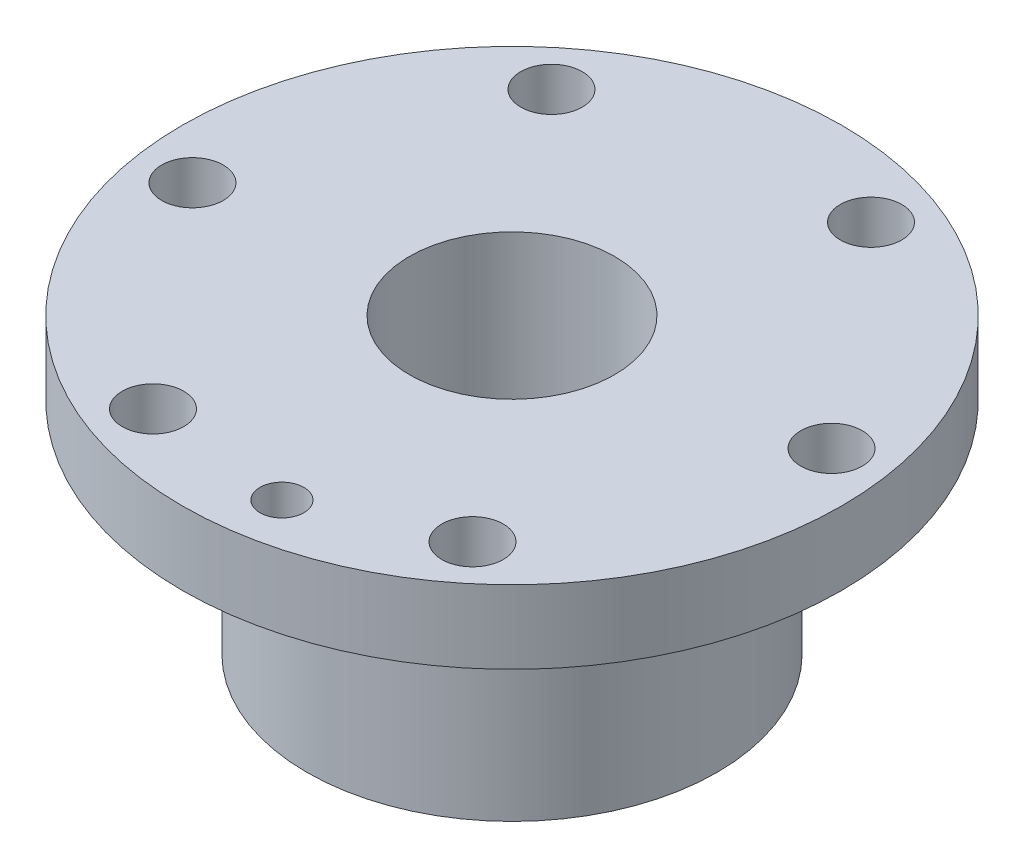
ISO-10303-21;
HEADER;
FILE_DESCRIPTION(('STEP AP214'),'2;1');
FILE_NAME('part.step','',(''),(''),'','','');
FILE_SCHEMA(('AUTOMOTIVE_DESIGN { 1 0 10303 214 1 1 1 1 }'));
ENDSEC;
DATA;
#1=APPLICATION_CONTEXT('core data for automotive mechanical design processes');
#2=APPLICATION_PROTOCOL_DEFINITION('international standard','automotive_design',2000,#1);
#3=PRODUCT_CONTEXT('',#1,'mechanical');
#4=PRODUCT('Part','Part','',(#3));
#5=PRODUCT_RELATED_PRODUCT_CATEGORY('part','',(#4));
#6=PRODUCT_DEFINITION_FORMATION('','',#4);
#7=PRODUCT_DEFINITION_CONTEXT('part definition',#1,'design');
#8=PRODUCT_DEFINITION('design','',#6,#7);
#9=PRODUCT_DEFINITION_SHAPE('','',#8);
#10=(LENGTH_UNIT() NAMED_UNIT(*) SI_UNIT(.MILLI.,.METRE.));
#11=(NAMED_UNIT(*) PLANE_ANGLE_UNIT() SI_UNIT($,.RADIAN.));
#12=(NAMED_UNIT(*) SI_UNIT($,.STERADIAN.) SOLID_ANGLE_UNIT());
#13=UNCERTAINTY_MEASURE_WITH_UNIT(LENGTH_MEASURE(1.E-05),#10,'distance_accuracy_value','');
#14=(GEOMETRIC_REPRESENTATION_CONTEXT(3) GLOBAL_UNCERTAINTY_ASSIGNED_CONTEXT((#13)) GLOBAL_UNIT_ASSIGNED_CONTEXT((#10,
#11,#12)) REPRESENTATION_CONTEXT('',''));
#15=CARTESIAN_POINT('',(0.,0.,0.));
#16=DIRECTION('',(0.,0.,1.));
#17=DIRECTION('',(1.,0.,0.));
#18=AXIS2_PLACEMENT_3D('',#15,#16,#17);
#19=CARTESIAN_POINT('',(0.,0.,0.));
#20=DIRECTION('',(0.,1.,0.));
#21=DIRECTION('',(0.,0.,1.));
#22=AXIS2_PLACEMENT_3D('',#19,#20,#21);
#23=PLANE('',#22);
#24=CARTESIAN_POINT('',(0.,0.,0.));
#25=DIRECTION('',(0.,1.,0.));
#26=DIRECTION('',(0.,0.,1.));
#27=AXIS2_PLACEMENT_3D('',#24,#25,#26);
#28=CIRCLE('',#27,14.);
#29=CARTESIAN_POINT('',(0.,0.,14.));
#30=VERTEX_POINT('',#29);
#31=EDGE_CURVE('E11',#30,#30,#28,.F.);
#32=ORIENTED_EDGE('',*,*,#31,.F.);
#33=EDGE_LOOP('',(#32));
#34=FACE_BOUND('',#33,.T.);
#35=CARTESIAN_POINT('',(-12.0199736534474,0.,-14.7146265114147));
#36=DIRECTION('',(0.,-1.,0.));
#37=DIRECTION('',(0.,0.,-1.));
#38=AXIS2_PLACEMENT_3D('',#35,#36,#37);
#39=CIRCLE('',#38,2.1);
#40=CARTESIAN_POINT('',(-12.0199736534474,0.,-16.8146265114147));
#41=VERTEX_POINT('',#40);
#42=EDGE_CURVE('E112',#41,#41,#39,.T.);
#43=ORIENTED_EDGE('',*,*,#42,.F.);
#44=EDGE_LOOP('',(#43));
#45=FACE_BOUND('',#44,.T.);
#46=CARTESIAN_POINT('',(6.73325353936205,0.,-17.7669157924122));
#47=DIRECTION('',(0.,-1.,0.));
#48=DIRECTION('',(0.,0.,-1.));
#49=AXIS2_PLACEMENT_3D('',#46,#47,#48);
#50=CIRCLE('',#49,2.1);
#51=CARTESIAN_POINT('',(6.73325353936205,0.,-19.8669157924122));
#52=VERTEX_POINT('',#51);
#53=EDGE_CURVE('E120',#52,#52,#50,.T.);
#54=ORIENTED_EDGE('',*,*,#53,.F.);
#55=EDGE_LOOP('',(#54));
#56=FACE_BOUND('',#55,.T.);
#57=CARTESIAN_POINT('',(18.753227192809,0.,-3.05228928099748));
#58=DIRECTION('',(0.,-1.,0.));
#59=DIRECTION('',(0.,0.,-1.));
#60=AXIS2_PLACEMENT_3D('',#57,#58,#59);
#61=CIRCLE('',#60,2.1);
#62=CARTESIAN_POINT('',(18.753227192809,0.,-5.15228928099748));
#63=VERTEX_POINT('',#62);
#64=EDGE_CURVE('E116',#63,#63,#61,.T.);
#65=ORIENTED_EDGE('',*,*,#64,.F.);
#66=EDGE_LOOP('',(#65));
#67=FACE_BOUND('',#66,.T.);
#68=CARTESIAN_POINT('',(12.0199736534472,0.,14.7146265114151));
#69=DIRECTION('',(0.,-1.,0.));
#70=DIRECTION('',(0.,0.,-1.));
#71=AXIS2_PLACEMENT_3D('',#68,#69,#70);
#72=CIRCLE('',#71,2.1);
#73=CARTESIAN_POINT('',(12.0199736534472,0.,12.6146265114151));
#74=VERTEX_POINT('',#73);
#75=EDGE_CURVE('E113',#74,#74,#72,.T.);
#76=ORIENTED_EDGE('',*,*,#75,.F.);
#77=EDGE_LOOP('',(#76));
#78=FACE_BOUND('',#77,.T.);
#79=CARTESIAN_POINT('',(3.05228928099752,0.,18.753227192809));
#80=DIRECTION('',(0.,-1.,0.));
#81=DIRECTION('',(0.,0.,-1.));
#82=AXIS2_PLACEMENT_3D('',#79,#80,#81);
#83=CIRCLE('',#82,1.5);
#84=CARTESIAN_POINT('',(3.05228928099752,0.,17.253227192809));
#85=VERTEX_POINT('',#84);
#86=EDGE_CURVE('E117',#85,#85,#83,.T.);
#87=ORIENTED_EDGE('',*,*,#86,.F.);
#88=EDGE_LOOP('',(#87));
#89=FACE_BOUND('',#88,.T.);
#90=CARTESIAN_POINT('',(-6.73325353936156,0.,17.7669157924125));
#91=DIRECTION('',(0.,-1.,0.));
#92=DIRECTION('',(0.,0.,-1.));
#93=AXIS2_PLACEMENT_3D('',#90,#91,#92);
#94=CIRCLE('',#93,2.1);
#95=CARTESIAN_POINT('',(-6.73325353936156,0.,15.6669157924125));
#96=VERTEX_POINT('',#95);
#97=EDGE_CURVE('E128',#96,#96,#94,.T.);
#98=ORIENTED_EDGE('',*,*,#97,.F.);
#99=EDGE_LOOP('',(#98));
#100=FACE_BOUND('',#99,.T.);
#101=CARTESIAN_POINT('',(-18.7532271928088,0.,3.05228928099774));
#102=DIRECTION('',(0.,-1.,0.));
#103=DIRECTION('',(0.,0.,-1.));
#104=AXIS2_PLACEMENT_3D('',#101,#102,#103);
#105=CIRCLE('',#104,2.1);
#106=CARTESIAN_POINT('',(-18.7532271928088,0.,0.952289280997739));
#107=VERTEX_POINT('',#106);
#108=EDGE_CURVE('E125',#107,#107,#105,.T.);
#109=ORIENTED_EDGE('',*,*,#108,.F.);
#110=EDGE_LOOP('',(#109));
#111=FACE_BOUND('',#110,.T.);
#112=CARTESIAN_POINT('',(0.,0.,0.));
#113=DIRECTION('',(0.,-1.,0.));
#114=DIRECTION('',(0.,0.,-1.));
#115=AXIS2_PLACEMENT_3D('',#112,#113,#114);
#116=CIRCLE('',#115,22.5);
#117=CARTESIAN_POINT('',(0.,0.,-22.5));
#118=VERTEX_POINT('',#117);
#119=EDGE_CURVE('E109',#118,#118,#116,.T.);
#120=ORIENTED_EDGE('',*,*,#119,.T.);
#121=EDGE_LOOP('',(#120));
#122=FACE_BOUND('',#121,.T.);
#123=ADVANCED_FACE('F75',(#34,#45,#56,#67,#78,#89,#100,#111,#122),#23,.F.);
#124=CARTESIAN_POINT('',(0.,10.,0.));
#125=DIRECTION('',(0.,-1.,0.));
#126=DIRECTION('',(0.,0.,-1.));
#127=AXIS2_PLACEMENT_3D('',#124,#125,#126);
#128=CYLINDRICAL_SURFACE('',#127,22.5);
#129=CARTESIAN_POINT('',(0.,5.,0.));
#130=DIRECTION('',(0.,1.,0.));
#131=DIRECTION('',(0.,0.,1.));
#132=AXIS2_PLACEMENT_3D('',#129,#130,#131);
#133=CIRCLE('',#132,22.5);
#134=CARTESIAN_POINT('',(0.,5.,22.5));
#135=VERTEX_POINT('',#134);
#136=EDGE_CURVE('E106',#135,#135,#133,.T.);
#137=ORIENTED_EDGE('',*,*,#136,.F.);
#138=EDGE_LOOP('',(#137));
#139=FACE_BOUND('',#138,.T.);
#140=ORIENTED_EDGE('',*,*,#119,.F.);
#141=EDGE_LOOP('',(#140));
#142=FACE_BOUND('',#141,.T.);
#143=ADVANCED_FACE('F201',(#139,#142),#128,.T.);
#144=CARTESIAN_POINT('',(-18.7532271928088,10.,3.05228928099774));
#145=DIRECTION('',(0.,-1.,0.));
#146=DIRECTION('',(0.,0.,-1.));
#147=AXIS2_PLACEMENT_3D('',#144,#145,#146);
#148=CYLINDRICAL_SURFACE('',#147,2.1);
#149=CARTESIAN_POINT('',(-18.7532271928088,5.,3.05228928099774));
#150=DIRECTION('',(0.,1.,0.));
#151=DIRECTION('',(0.,0.,1.));
#152=AXIS2_PLACEMENT_3D('',#149,#150,#151);
#153=CIRCLE('',#152,2.1);
#154=CARTESIAN_POINT('',(-18.7532271928088,5.,5.15228928099774));
#155=VERTEX_POINT('',#154);
#156=EDGE_CURVE('E103',#155,#155,#153,.T.);
#157=ORIENTED_EDGE('',*,*,#156,.T.);
#158=EDGE_LOOP('',(#157));
#159=FACE_BOUND('',#158,.T.);
#160=ORIENTED_EDGE('',*,*,#108,.T.);
#161=EDGE_LOOP('',(#160));
#162=FACE_BOUND('',#161,.T.);
#163=ADVANCED_FACE('F206',(#159,#162),#148,.F.);
#164=CARTESIAN_POINT('',(-6.73325353936156,10.,17.7669157924125));
#165=DIRECTION('',(0.,-1.,0.));
#166=DIRECTION('',(0.,0.,-1.));
#167=AXIS2_PLACEMENT_3D('',#164,#165,#166);
#168=CYLINDRICAL_SURFACE('',#167,2.1);
#169=CARTESIAN_POINT('',(-6.73325353936156,5.,17.7669157924125));
#170=DIRECTION('',(0.,1.,0.));
#171=DIRECTION('',(0.,0.,1.));
#172=AXIS2_PLACEMENT_3D('',#169,#170,#171);
#173=CIRCLE('',#172,2.1);
#174=CARTESIAN_POINT('',(-6.73325353936156,5.,19.8669157924125));
#175=VERTEX_POINT('',#174);
#176=EDGE_CURVE('E100',#175,#175,#173,.T.);
#177=ORIENTED_EDGE('',*,*,#176,.T.);
#178=EDGE_LOOP('',(#177));
#179=FACE_BOUND('',#178,.T.);
#180=ORIENTED_EDGE('',*,*,#97,.T.);
#181=EDGE_LOOP('',(#180));
#182=FACE_BOUND('',#181,.T.);
#183=ADVANCED_FACE('F228',(#179,#182),#168,.F.);
#184=CARTESIAN_POINT('',(3.05228928099752,10.,18.753227192809));
#185=DIRECTION('',(0.,-1.,0.));
#186=DIRECTION('',(0.,0.,-1.));
#187=AXIS2_PLACEMENT_3D('',#184,#185,#186);
#188=CYLINDRICAL_SURFACE('',#187,1.5);
#189=CARTESIAN_POINT('',(3.05228928099752,5.,18.753227192809));
#190=DIRECTION('',(0.,1.,0.));
#191=DIRECTION('',(0.,0.,1.));
#192=AXIS2_PLACEMENT_3D('',#189,#190,#191);
#193=CIRCLE('',#192,1.5);
#194=CARTESIAN_POINT('',(3.05228928099752,5.,20.253227192809));
#195=VERTEX_POINT('',#194);
#196=EDGE_CURVE('E97',#195,#195,#193,.T.);
#197=ORIENTED_EDGE('',*,*,#196,.T.);
#198=EDGE_LOOP('',(#197));
#199=FACE_BOUND('',#198,.T.);
#200=ORIENTED_EDGE('',*,*,#86,.T.);
#201=EDGE_LOOP('',(#200));
#202=FACE_BOUND('',#201,.T.);
#203=ADVANCED_FACE('F234',(#199,#202),#188,.F.);
#204=CARTESIAN_POINT('',(12.0199736534472,10.,14.7146265114151));
#205=DIRECTION('',(0.,-1.,0.));
#206=DIRECTION('',(0.,0.,-1.));
#207=AXIS2_PLACEMENT_3D('',#204,#205,#206);
#208=CYLINDRICAL_SURFACE('',#207,2.1);
#209=CARTESIAN_POINT('',(12.0199736534472,5.,14.7146265114151));
#210=DIRECTION('',(0.,1.,0.));
#211=DIRECTION('',(0.,0.,1.));
#212=AXIS2_PLACEMENT_3D('',#209,#210,#211);
#213=CIRCLE('',#212,2.1);
#214=CARTESIAN_POINT('',(12.0199736534472,5.,16.8146265114151));
#215=VERTEX_POINT('',#214);
#216=EDGE_CURVE('E94',#215,#215,#213,.T.);
#217=ORIENTED_EDGE('',*,*,#216,.T.);
#218=EDGE_LOOP('',(#217));
#219=FACE_BOUND('',#218,.T.);
#220=ORIENTED_EDGE('',*,*,#75,.T.);
#221=EDGE_LOOP('',(#220));
#222=FACE_BOUND('',#221,.T.);
#223=ADVANCED_FACE('F247',(#219,#222),#208,.F.);
#224=CARTESIAN_POINT('',(18.753227192809,10.,-3.05228928099748));
#225=DIRECTION('',(0.,-1.,0.));
#226=DIRECTION('',(0.,0.,-1.));
#227=AXIS2_PLACEMENT_3D('',#224,#225,#226);
#228=CYLINDRICAL_SURFACE('',#227,2.1);
#229=CARTESIAN_POINT('',(18.753227192809,5.,-3.05228928099748));
#230=DIRECTION('',(0.,1.,0.));
#231=DIRECTION('',(0.,0.,1.));
#232=AXIS2_PLACEMENT_3D('',#229,#230,#231);
#233=CIRCLE('',#232,2.1);
#234=CARTESIAN_POINT('',(18.753227192809,5.,-0.952289280997483));
#235=VERTEX_POINT('',#234);
#236=EDGE_CURVE('E89',#235,#235,#233,.T.);
#237=ORIENTED_EDGE('',*,*,#236,.T.);
#238=EDGE_LOOP('',(#237));
#239=FACE_BOUND('',#238,.T.);
#240=ORIENTED_EDGE('',*,*,#64,.T.);
#241=EDGE_LOOP('',(#240));
#242=FACE_BOUND('',#241,.T.);
#243=ADVANCED_FACE('F243',(#239,#242),#228,.F.);
#244=CARTESIAN_POINT('',(6.73325353936205,10.,-17.7669157924122));
#245=DIRECTION('',(0.,-1.,0.));
#246=DIRECTION('',(0.,0.,-1.));
#247=AXIS2_PLACEMENT_3D('',#244,#245,#246);
#248=CYLINDRICAL_SURFACE('',#247,2.1);
#249=CARTESIAN_POINT('',(6.73325353936205,5.,-17.7669157924122));
#250=DIRECTION('',(0.,1.,0.));
#251=DIRECTION('',(0.,0.,1.));
#252=AXIS2_PLACEMENT_3D('',#249,#250,#251);
#253=CIRCLE('',#252,2.1);
#254=CARTESIAN_POINT('',(6.73325353936205,5.,-15.6669157924122));
#255=VERTEX_POINT('',#254);
#256=EDGE_CURVE('E85',#255,#255,#253,.T.);
#257=ORIENTED_EDGE('',*,*,#256,.T.);
#258=EDGE_LOOP('',(#257));
#259=FACE_BOUND('',#258,.T.);
#260=ORIENTED_EDGE('',*,*,#53,.T.);
#261=EDGE_LOOP('',(#260));
#262=FACE_BOUND('',#261,.T.);
#263=ADVANCED_FACE('F240',(#259,#262),#248,.F.);
#264=CARTESIAN_POINT('',(-12.0199736534474,10.,-14.7146265114147));
#265=DIRECTION('',(0.,-1.,0.));
#266=DIRECTION('',(0.,0.,-1.));
#267=AXIS2_PLACEMENT_3D('',#264,#265,#266);
#268=CYLINDRICAL_SURFACE('',#267,2.1);
#269=CARTESIAN_POINT('',(-12.0199736534474,5.,-14.7146265114147));
#270=DIRECTION('',(0.,1.,0.));
#271=DIRECTION('',(0.,0.,1.));
#272=AXIS2_PLACEMENT_3D('',#269,#270,#271);
#273=CIRCLE('',#272,2.1);
#274=CARTESIAN_POINT('',(-12.0199736534474,5.,-12.6146265114147));
#275=VERTEX_POINT('',#274);
#276=EDGE_CURVE('E81',#275,#275,#273,.T.);
#277=ORIENTED_EDGE('',*,*,#276,.T.);
#278=EDGE_LOOP('',(#277));
#279=FACE_BOUND('',#278,.T.);
#280=ORIENTED_EDGE('',*,*,#42,.T.);
#281=EDGE_LOOP('',(#280));
#282=FACE_BOUND('',#281,.T.);
#283=ADVANCED_FACE('F198',(#279,#282),#268,.F.);
#284=CARTESIAN_POINT('',(0.,5.,0.));
#285=DIRECTION('',(0.,1.,0.));
#286=DIRECTION('',(0.,0.,1.));
#287=AXIS2_PLACEMENT_3D('',#284,#285,#286);
#288=PLANE('',#287);
#289=CARTESIAN_POINT('',(0.,5.,0.));
#290=DIRECTION('',(0.,-1.,0.));
#291=DIRECTION('',(0.,0.,-1.));
#292=AXIS2_PLACEMENT_3D('',#289,#290,#291);
#293=CIRCLE('',#292,7.00000000000021);
#294=CARTESIAN_POINT('',(0.,5.,-7.00000000000021));
#295=VERTEX_POINT('',#294);
#296=EDGE_CURVE('E141',#295,#295,#293,.T.);
#297=ORIENTED_EDGE('',*,*,#296,.T.);
#298=EDGE_LOOP('',(#297));
#299=FACE_BOUND('',#298,.T.);
#300=ORIENTED_EDGE('',*,*,#276,.F.);
#301=EDGE_LOOP('',(#300));
#302=FACE_BOUND('',#301,.T.);
#303=ORIENTED_EDGE('',*,*,#256,.F.);
#304=EDGE_LOOP('',(#303));
#305=FACE_BOUND('',#304,.T.);
#306=ORIENTED_EDGE('',*,*,#236,.F.);
#307=EDGE_LOOP('',(#306));
#308=FACE_BOUND('',#307,.T.);
#309=ORIENTED_EDGE('',*,*,#216,.F.);
#310=EDGE_LOOP('',(#309));
#311=FACE_BOUND('',#310,.T.);
#312=ORIENTED_EDGE('',*,*,#196,.F.);
#313=EDGE_LOOP('',(#312));
#314=FACE_BOUND('',#313,.T.);
#315=ORIENTED_EDGE('',*,*,#176,.F.);
#316=EDGE_LOOP('',(#315));
#317=FACE_BOUND('',#316,.T.);
#318=ORIENTED_EDGE('',*,*,#156,.F.);
#319=EDGE_LOOP('',(#318));
#320=FACE_BOUND('',#319,.T.);
#321=ORIENTED_EDGE('',*,*,#136,.T.);
#322=EDGE_LOOP('',(#321));
#323=FACE_BOUND('',#322,.T.);
#324=ADVANCED_FACE('F167',(#299,#302,#305,#308,#311,#314,#317,#320,#323),#288,.T.);
#325=CARTESIAN_POINT('',(0.,-15.,0.));
#326=DIRECTION('',(0.,1.,0.));
#327=DIRECTION('',(0.,0.,1.));
#328=AXIS2_PLACEMENT_3D('',#325,#326,#327);
#329=CYLINDRICAL_SURFACE('',#328,14.);
#330=CARTESIAN_POINT('',(0.,-15.,0.));
#331=DIRECTION('',(0.,-1.,0.));
#332=DIRECTION('',(0.,0.,-1.));
#333=AXIS2_PLACEMENT_3D('',#330,#331,#332);
#334=CIRCLE('',#333,14.);
#335=CARTESIAN_POINT('',(0.,-15.,-14.));
#336=VERTEX_POINT('',#335);
#337=EDGE_CURVE('E129',#336,#336,#334,.T.);
#338=ORIENTED_EDGE('',*,*,#337,.F.);
#339=EDGE_LOOP('',(#338));
#340=FACE_BOUND('',#339,.T.);
#341=ORIENTED_EDGE('',*,*,#31,.T.);
#342=EDGE_LOOP('',(#341));
#343=FACE_BOUND('',#342,.T.);
#344=ADVANCED_FACE('F181',(#340,#343),#329,.T.);
#345=CARTESIAN_POINT('',(0.,-15.,0.));
#346=DIRECTION('',(0.,-1.,0.));
#347=DIRECTION('',(0.,0.,-1.));
#348=AXIS2_PLACEMENT_3D('',#345,#346,#347);
#349=PLANE('',#348);
#350=CARTESIAN_POINT('',(0.,-15.,0.));
#351=DIRECTION('',(0.,-1.,0.));
#352=DIRECTION('',(0.,0.,-1.));
#353=AXIS2_PLACEMENT_3D('',#350,#351,#352);
#354=CIRCLE('',#353,7.00000000000021);
#355=CARTESIAN_POINT('',(0.,-15.,-7.00000000000021));
#356=VERTEX_POINT('',#355);
#357=EDGE_CURVE('E161',#356,#356,#354,.T.);
#358=ORIENTED_EDGE('',*,*,#357,.F.);
#359=EDGE_LOOP('',(#358));
#360=FACE_BOUND('',#359,.T.);
#361=CARTESIAN_POINT('',(-0.978927696834247,-15.,9.95196968264894));
#362=DIRECTION('',(0.,-1.,0.));
#363=DIRECTION('',(0.,0.,-1.));
#364=AXIS2_PLACEMENT_3D('',#361,#362,#363);
#365=CIRCLE('',#364,2.00000000000029);
#366=CARTESIAN_POINT('',(-0.978927696834247,-15.,7.95196968264866));
#367=VERTEX_POINT('',#366);
#368=EDGE_CURVE('E156',#367,#367,#365,.T.);
#369=ORIENTED_EDGE('',*,*,#368,.F.);
#370=EDGE_LOOP('',(#369));
#371=FACE_BOUND('',#370,.T.);
#372=CARTESIAN_POINT('',(-9.95196968264876,-15.,-0.978927696835049));
#373=DIRECTION('',(0.,-1.,0.));
#374=DIRECTION('',(0.,0.,-1.));
#375=AXIS2_PLACEMENT_3D('',#372,#373,#374);
#376=CIRCLE('',#375,2.00000000000041);
#377=CARTESIAN_POINT('',(-9.95196968264876,-15.,-2.97892769683546));
#378=VERTEX_POINT('',#377);
#379=EDGE_CURVE('E150',#378,#378,#376,.T.);
#380=ORIENTED_EDGE('',*,*,#379,.F.);
#381=EDGE_LOOP('',(#380));
#382=FACE_BOUND('',#381,.T.);
#383=CARTESIAN_POINT('',(0.978927696835223,-15.,-9.95196968264956));
#384=DIRECTION('',(0.,-1.,0.));
#385=DIRECTION('',(0.,0.,-1.));
#386=AXIS2_PLACEMENT_3D('',#383,#384,#385);
#387=CIRCLE('',#386,2.);
#388=CARTESIAN_POINT('',(0.978927696835223,-15.,-11.9519696826496));
#389=VERTEX_POINT('',#388);
#390=EDGE_CURVE('E144',#389,#389,#387,.T.);
#391=ORIENTED_EDGE('',*,*,#390,.F.);
#392=EDGE_LOOP('',(#391));
#393=FACE_BOUND('',#392,.T.);
#394=CARTESIAN_POINT('',(9.95196968264974,-15.,0.978927696834437));
#395=DIRECTION('',(0.,-1.,0.));
#396=DIRECTION('',(0.,0.,-1.));
#397=AXIS2_PLACEMENT_3D('',#394,#395,#396);
#398=CIRCLE('',#397,1.99999999999989);
#399=CARTESIAN_POINT('',(9.95196968264974,-15.,-1.02107230316546));
#400=VERTEX_POINT('',#399);
#401=EDGE_CURVE('E137',#400,#400,#398,.T.);
#402=ORIENTED_EDGE('',*,*,#401,.F.);
#403=EDGE_LOOP('',(#402));
#404=FACE_BOUND('',#403,.T.);
#405=ORIENTED_EDGE('',*,*,#337,.T.);
#406=EDGE_LOOP('',(#405));
#407=FACE_BOUND('',#406,.T.);
#408=ADVANCED_FACE('F177',(#360,#371,#382,#393,#404,#407),#349,.T.);
#409=CARTESIAN_POINT('',(9.95196968264974,-9.,0.978927696834437));
#410=DIRECTION('',(0.,-1.,0.));
#411=DIRECTION('',(0.,0.,-1.));
#412=AXIS2_PLACEMENT_3D('',#409,#410,#411);
#413=CYLINDRICAL_SURFACE('',#412,1.99999999999989);
#414=CARTESIAN_POINT('',(9.95196968264974,-9.,0.978927696834437));
#415=DIRECTION('',(0.,-1.,0.));
#416=DIRECTION('',(0.,0.,-1.));
#417=AXIS2_PLACEMENT_3D('',#414,#415,#416);
#418=CIRCLE('',#417,1.99999999999989);
#419=CARTESIAN_POINT('',(9.95196968264974,-9.,-1.02107230316546));
#420=VERTEX_POINT('',#419);
#421=EDGE_CURVE('E140',#420,#420,#418,.T.);
#422=ORIENTED_EDGE('',*,*,#421,.F.);
#423=EDGE_LOOP('',(#422));
#424=FACE_BOUND('',#423,.T.);
#425=ORIENTED_EDGE('',*,*,#401,.T.);
#426=EDGE_LOOP('',(#425));
#427=FACE_BOUND('',#426,.T.);
#428=ADVANCED_FACE('F180',(#424,#427),#413,.F.);
#429=CARTESIAN_POINT('',(9.95196968264974,-9.,0.978927696834437));
#430=DIRECTION('',(0.,-1.,0.));
#431=DIRECTION('',(0.,0.,-1.));
#432=AXIS2_PLACEMENT_3D('',#429,#430,#431);
#433=PLANE('',#432);
#434=ORIENTED_EDGE('',*,*,#421,.T.);
#435=EDGE_LOOP('',(#434));
#436=FACE_BOUND('',#435,.T.);
#437=ADVANCED_FACE('F313',(#436),#433,.T.);
#438=CARTESIAN_POINT('',(0.978927696835223,-9.,-9.95196968264956));
#439=DIRECTION('',(0.,-1.,0.));
#440=DIRECTION('',(0.,0.,-1.));
#441=AXIS2_PLACEMENT_3D('',#438,#439,#440);
#442=CYLINDRICAL_SURFACE('',#441,2.);
#443=CARTESIAN_POINT('',(0.978927696835223,-9.,-9.95196968264956));
#444=DIRECTION('',(0.,-1.,0.));
#445=DIRECTION('',(0.,0.,-1.));
#446=AXIS2_PLACEMENT_3D('',#443,#444,#445);
#447=CIRCLE('',#446,2.);
#448=CARTESIAN_POINT('',(0.978927696835223,-9.,-11.9519696826496));
#449=VERTEX_POINT('',#448);
#450=EDGE_CURVE('E147',#449,#449,#447,.T.);
#451=ORIENTED_EDGE('',*,*,#450,.F.);
#452=EDGE_LOOP('',(#451));
#453=FACE_BOUND('',#452,.T.);
#454=ORIENTED_EDGE('',*,*,#390,.T.);
#455=EDGE_LOOP('',(#454));
#456=FACE_BOUND('',#455,.T.);
#457=ADVANCED_FACE('F323',(#453,#456),#442,.F.);
#458=CARTESIAN_POINT('',(0.978927696835223,-9.,-9.95196968264956));
#459=DIRECTION('',(0.,-1.,0.));
#460=DIRECTION('',(0.,0.,-1.));
#461=AXIS2_PLACEMENT_3D('',#458,#459,#460);
#462=PLANE('',#461);
#463=ORIENTED_EDGE('',*,*,#450,.T.);
#464=EDGE_LOOP('',(#463));
#465=FACE_BOUND('',#464,.T.);
#466=ADVANCED_FACE('F333',(#465),#462,.T.);
#467=CARTESIAN_POINT('',(-9.95196968264876,-9.,-0.978927696835049));
#468=DIRECTION('',(0.,-1.,0.));
#469=DIRECTION('',(0.,0.,-1.));
#470=AXIS2_PLACEMENT_3D('',#467,#468,#469);
#471=CYLINDRICAL_SURFACE('',#470,2.00000000000041);
#472=CARTESIAN_POINT('',(-9.95196968264876,-9.,-0.978927696835049));
#473=DIRECTION('',(0.,-1.,0.));
#474=DIRECTION('',(0.,0.,-1.));
#475=AXIS2_PLACEMENT_3D('',#472,#473,#474);
#476=CIRCLE('',#475,2.00000000000041);
#477=CARTESIAN_POINT('',(-9.95196968264876,-9.,-2.97892769683546));
#478=VERTEX_POINT('',#477);
#479=EDGE_CURVE('E153',#478,#478,#476,.T.);
#480=ORIENTED_EDGE('',*,*,#479,.F.);
#481=EDGE_LOOP('',(#480));
#482=FACE_BOUND('',#481,.T.);
#483=ORIENTED_EDGE('',*,*,#379,.T.);
#484=EDGE_LOOP('',(#483));
#485=FACE_BOUND('',#484,.T.);
#486=ADVANCED_FACE('F343',(#482,#485),#471,.F.);
#487=CARTESIAN_POINT('',(-9.95196968264876,-9.,-0.978927696835049));
#488=DIRECTION('',(0.,-1.,0.));
#489=DIRECTION('',(0.,0.,-1.));
#490=AXIS2_PLACEMENT_3D('',#487,#488,#489);
#491=PLANE('',#490);
#492=ORIENTED_EDGE('',*,*,#479,.T.);
#493=EDGE_LOOP('',(#492));
#494=FACE_BOUND('',#493,.T.);
#495=ADVANCED_FACE('F353',(#494),#491,.T.);
#496=CARTESIAN_POINT('',(-0.978927696834247,-9.,9.95196968264894));
#497=DIRECTION('',(0.,-1.,0.));
#498=DIRECTION('',(0.,0.,-1.));
#499=AXIS2_PLACEMENT_3D('',#496,#497,#498);
#500=CYLINDRICAL_SURFACE('',#499,2.00000000000029);
#501=CARTESIAN_POINT('',(-0.978927696834247,-9.,9.95196968264894));
#502=DIRECTION('',(0.,-1.,0.));
#503=DIRECTION('',(0.,0.,-1.));
#504=AXIS2_PLACEMENT_3D('',#501,#502,#503);
#505=CIRCLE('',#504,2.00000000000029);
#506=CARTESIAN_POINT('',(-0.978927696834247,-9.,7.95196968264866));
#507=VERTEX_POINT('',#506);
#508=EDGE_CURVE('E136',#507,#507,#505,.T.);
#509=ORIENTED_EDGE('',*,*,#508,.F.);
#510=EDGE_LOOP('',(#509));
#511=FACE_BOUND('',#510,.T.);
#512=ORIENTED_EDGE('',*,*,#368,.T.);
#513=EDGE_LOOP('',(#512));
#514=FACE_BOUND('',#513,.T.);
#515=ADVANCED_FACE('F363',(#511,#514),#500,.F.);
#516=CARTESIAN_POINT('',(-0.978927696834247,-9.,9.95196968264894));
#517=DIRECTION('',(0.,-1.,0.));
#518=DIRECTION('',(0.,0.,-1.));
#519=AXIS2_PLACEMENT_3D('',#516,#517,#518);
#520=PLANE('',#519);
#521=ORIENTED_EDGE('',*,*,#508,.T.);
#522=EDGE_LOOP('',(#521));
#523=FACE_BOUND('',#522,.T.);
#524=ADVANCED_FACE('F173',(#523),#520,.T.);
#525=CARTESIAN_POINT('',(0.,5.,0.));
#526=DIRECTION('',(0.,-1.,0.));
#527=DIRECTION('',(0.,0.,-1.));
#528=AXIS2_PLACEMENT_3D('',#525,#526,#527);
#529=CYLINDRICAL_SURFACE('',#528,7.00000000000021);
#530=ORIENTED_EDGE('',*,*,#296,.F.);
#531=EDGE_LOOP('',(#530));
#532=FACE_BOUND('',#531,.T.);
#533=ORIENTED_EDGE('',*,*,#357,.T.);
#534=EDGE_LOOP('',(#533));
#535=FACE_BOUND('',#534,.T.);
#536=ADVANCED_FACE('F170',(#532,#535),#529,.F.);
#537=CLOSED_SHELL('',(#123,#143,#163,#183,#203,#223,#243,#263,#283,#324,#344,#408,#428,#437,
#457,#466,#486,#495,#515,#524,#536));
#538=MANIFOLD_SOLID_BREP('B2',#537);
#539=ADVANCED_BREP_SHAPE_REPRESENTATION('',(#18,#538),#14);
#540=SHAPE_DEFINITION_REPRESENTATION(#9,#539);
ENDSEC;
END-ISO-10303-21;
